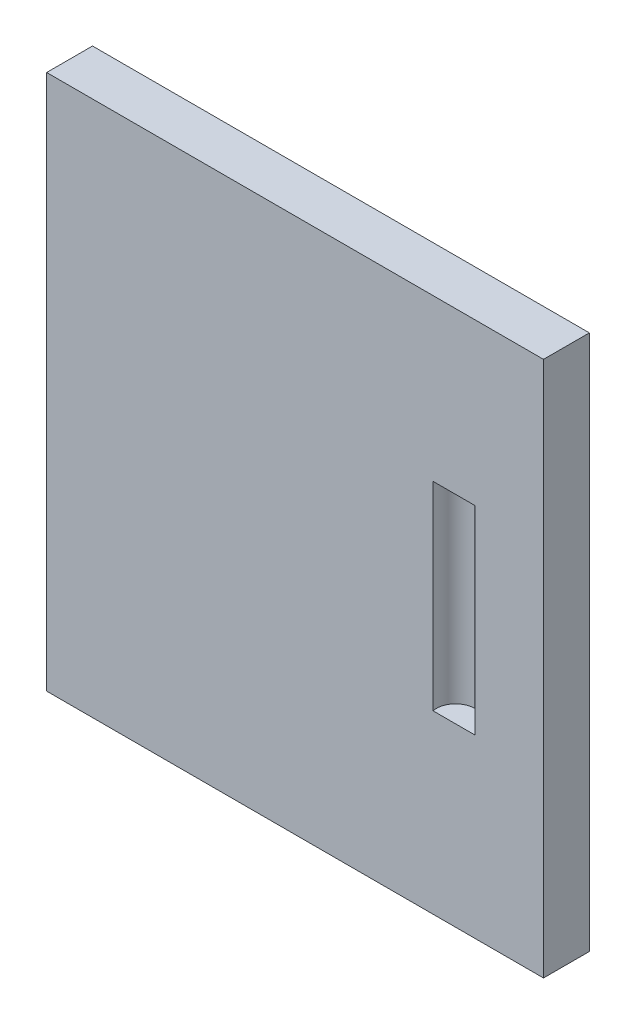
ISO-10303-21;
HEADER;
FILE_DESCRIPTION(('STEP AP214'),'2;1');
FILE_NAME('part.step','',(''),(''),'','','');
FILE_SCHEMA(('AUTOMOTIVE_DESIGN { 1 0 10303 214 1 1 1 1 }'));
ENDSEC;
DATA;
#1=APPLICATION_CONTEXT('core data for automotive mechanical design processes');
#2=APPLICATION_PROTOCOL_DEFINITION('international standard','automotive_design',2000,#1);
#3=PRODUCT_CONTEXT('',#1,'mechanical');
#4=PRODUCT('Part','Part','',(#3));
#5=PRODUCT_RELATED_PRODUCT_CATEGORY('part','',(#4));
#6=PRODUCT_DEFINITION_FORMATION('','',#4);
#7=PRODUCT_DEFINITION_CONTEXT('part definition',#1,'design');
#8=PRODUCT_DEFINITION('design','',#6,#7);
#9=PRODUCT_DEFINITION_SHAPE('','',#8);
#10=(LENGTH_UNIT() NAMED_UNIT(*) SI_UNIT(.MILLI.,.METRE.));
#11=(NAMED_UNIT(*) PLANE_ANGLE_UNIT() SI_UNIT($,.RADIAN.));
#12=(NAMED_UNIT(*) SI_UNIT($,.STERADIAN.) SOLID_ANGLE_UNIT());
#13=UNCERTAINTY_MEASURE_WITH_UNIT(LENGTH_MEASURE(1.E-05),#10,'distance_accuracy_value','');
#14=(GEOMETRIC_REPRESENTATION_CONTEXT(3) GLOBAL_UNCERTAINTY_ASSIGNED_CONTEXT((#13)) GLOBAL_UNIT_ASSIGNED_CONTEXT((#10,
#11,#12)) REPRESENTATION_CONTEXT('',''));
#15=CARTESIAN_POINT('',(0.,0.,0.));
#16=DIRECTION('',(0.,0.,1.));
#17=DIRECTION('',(1.,0.,0.));
#18=AXIS2_PLACEMENT_3D('',#15,#16,#17);
#19=CARTESIAN_POINT('',(-155.,-135.,-5.));
#20=DIRECTION('',(0.,0.,-1.));
#21=DIRECTION('',(-1.,0.,0.));
#22=AXIS2_PLACEMENT_3D('',#19,#20,#21);
#23=CYLINDRICAL_SURFACE('',#22,2.5);
#24=CARTESIAN_POINT('',(-155.,-135.,-5.));
#25=DIRECTION('',(0.,0.,1.));
#26=DIRECTION('',(-1.,0.,0.));
#27=AXIS2_PLACEMENT_3D('',#24,#25,#26);
#28=CIRCLE('',#27,2.5);
#29=CARTESIAN_POINT('',(-157.489397517473,-134.77,-5.));
#30=VERTEX_POINT('',#29);
#31=CARTESIAN_POINT('',(-152.510602482527,-134.77,-5.));
#32=VERTEX_POINT('',#31);
#33=EDGE_CURVE('E150',#30,#32,#28,.T.);
#34=ORIENTED_EDGE('',*,*,#33,.T.);
#35=DIRECTION('',(0.,0.,-1.));
#36=VECTOR('',#35,1.);
#37=CARTESIAN_POINT('',(-152.510602482527,-134.77,-10.));
#38=LINE('',#37,#36);
#39=CARTESIAN_POINT('',(-152.510602482527,-134.77,-15.));
#40=VERTEX_POINT('',#39);
#41=EDGE_CURVE('E143',#32,#40,#38,.T.);
#42=ORIENTED_EDGE('',*,*,#41,.T.);
#43=CARTESIAN_POINT('',(-155.,-135.,-15.));
#44=DIRECTION('',(0.,0.,1.));
#45=DIRECTION('',(-1.,0.,0.));
#46=AXIS2_PLACEMENT_3D('',#43,#44,#45);
#47=CIRCLE('',#46,2.5);
#48=CARTESIAN_POINT('',(-157.489397517473,-134.77,-15.));
#49=VERTEX_POINT('',#48);
#50=EDGE_CURVE('E152',#49,#40,#47,.T.);
#51=ORIENTED_EDGE('',*,*,#50,.F.);
#52=DIRECTION('',(0.,0.,-1.));
#53=VECTOR('',#52,1.);
#54=CARTESIAN_POINT('',(-157.489397517473,-134.77,-10.));
#55=LINE('',#54,#53);
#56=EDGE_CURVE('E140',#49,#30,#55,.F.);
#57=ORIENTED_EDGE('',*,*,#56,.T.);
#58=EDGE_LOOP('',(#34,#42,#51,#57));
#59=FACE_BOUND('',#58,.T.);
#60=ADVANCED_FACE('F45',(#59),#23,.F.);
#61=CARTESIAN_POINT('',(-162.5,-200.,15.));
#62=DIRECTION('',(1.,0.,0.));
#63=DIRECTION('',(0.,0.,-1.));
#64=AXIS2_PLACEMENT_3D('',#61,#62,#63);
#65=PLANE('',#64);
#66=DIRECTION('',(0.,-1.,0.));
#67=VECTOR('',#66,1.);
#68=CARTESIAN_POINT('',(-162.5,-200.,15.));
#69=LINE('',#68,#67);
#70=CARTESIAN_POINT('',(-162.5,150.46,15.));
#71=VERTEX_POINT('',#70);
#72=CARTESIAN_POINT('',(-162.5,-200.,15.));
#73=VERTEX_POINT('',#72);
#74=EDGE_CURVE('E173',#71,#73,#69,.T.);
#75=ORIENTED_EDGE('',*,*,#74,.F.);
#76=DIRECTION('',(0.,0.,1.));
#77=VECTOR('',#76,1.);
#78=CARTESIAN_POINT('',(-162.5,150.46,-15.));
#79=LINE('',#78,#77);
#80=CARTESIAN_POINT('',(-162.5,150.46,-15.));
#81=VERTEX_POINT('',#80);
#82=EDGE_CURVE('E274',#81,#71,#79,.T.);
#83=ORIENTED_EDGE('',*,*,#82,.F.);
#84=DIRECTION('',(0.,-1.,0.));
#85=VECTOR('',#84,1.);
#86=CARTESIAN_POINT('',(-162.5,-200.,-15.));
#87=LINE('',#86,#85);
#88=CARTESIAN_POINT('',(-162.5,-200.,-15.));
#89=VERTEX_POINT('',#88);
#90=EDGE_CURVE('E171',#81,#89,#87,.T.);
#91=ORIENTED_EDGE('',*,*,#90,.T.);
#92=DIRECTION('',(0.,0.,-1.));
#93=VECTOR('',#92,1.);
#94=CARTESIAN_POINT('',(-162.5,-200.,15.));
#95=LINE('',#94,#93);
#96=EDGE_CURVE('E196',#73,#89,#95,.T.);
#97=ORIENTED_EDGE('',*,*,#96,.F.);
#98=EDGE_LOOP('',(#75,#83,#91,#97));
#99=FACE_BOUND('',#98,.T.);
#100=ADVANCED_FACE('F47',(#99),#65,.F.);
#101=CARTESIAN_POINT('',(162.5,-200.,15.));
#102=DIRECTION('',(0.,1.,0.));
#103=DIRECTION('',(-1.,0.,0.));
#104=AXIS2_PLACEMENT_3D('',#101,#102,#103);
#105=PLANE('',#104);
#106=DIRECTION('',(1.,0.,0.));
#107=VECTOR('',#106,1.);
#108=CARTESIAN_POINT('',(162.5,-200.,-15.));
#109=LINE('',#108,#107);
#110=CARTESIAN_POINT('',(162.5,-200.,-15.));
#111=VERTEX_POINT('',#110);
#112=EDGE_CURVE('E187',#89,#111,#109,.T.);
#113=ORIENTED_EDGE('',*,*,#112,.T.);
#114=DIRECTION('',(0.,0.,-1.));
#115=VECTOR('',#114,1.);
#116=CARTESIAN_POINT('',(162.5,-200.,15.));
#117=LINE('',#116,#115);
#118=CARTESIAN_POINT('',(162.5,-200.,15.));
#119=VERTEX_POINT('',#118);
#120=EDGE_CURVE('E184',#119,#111,#117,.T.);
#121=ORIENTED_EDGE('',*,*,#120,.F.);
#122=DIRECTION('',(1.,0.,0.));
#123=VECTOR('',#122,1.);
#124=CARTESIAN_POINT('',(162.5,-200.,15.));
#125=LINE('',#124,#123);
#126=EDGE_CURVE('E176',#73,#119,#125,.T.);
#127=ORIENTED_EDGE('',*,*,#126,.F.);
#128=ORIENTED_EDGE('',*,*,#96,.T.);
#129=EDGE_LOOP('',(#113,#121,#127,#128));
#130=FACE_BOUND('',#129,.T.);
#131=ADVANCED_FACE('F319',(#130),#105,.F.);
#132=CARTESIAN_POINT('',(162.5,-200.,15.));
#133=DIRECTION('',(-1.,0.,0.));
#134=DIRECTION('',(0.,0.,1.));
#135=AXIS2_PLACEMENT_3D('',#132,#133,#134);
#136=PLANE('',#135);
#137=DIRECTION('',(0.,1.,0.));
#138=VECTOR('',#137,1.);
#139=CARTESIAN_POINT('',(162.5,-200.,-15.));
#140=LINE('',#139,#138);
#141=CARTESIAN_POINT('',(162.5,150.46,-15.));
#142=VERTEX_POINT('',#141);
#143=EDGE_CURVE('E177',#111,#142,#140,.T.);
#144=ORIENTED_EDGE('',*,*,#143,.T.);
#145=DIRECTION('',(0.,0.,1.));
#146=VECTOR('',#145,1.);
#147=CARTESIAN_POINT('',(162.5,150.46,15.));
#148=LINE('',#147,#146);
#149=CARTESIAN_POINT('',(162.5,150.46,15.));
#150=VERTEX_POINT('',#149);
#151=EDGE_CURVE('E279',#142,#150,#148,.T.);
#152=ORIENTED_EDGE('',*,*,#151,.T.);
#153=DIRECTION('',(0.,1.,0.));
#154=VECTOR('',#153,1.);
#155=CARTESIAN_POINT('',(162.5,-200.,15.));
#156=LINE('',#155,#154);
#157=EDGE_CURVE('E180',#119,#150,#156,.T.);
#158=ORIENTED_EDGE('',*,*,#157,.F.);
#159=ORIENTED_EDGE('',*,*,#120,.T.);
#160=EDGE_LOOP('',(#144,#152,#158,#159));
#161=FACE_BOUND('',#160,.T.);
#162=ADVANCED_FACE('F330',(#161),#136,.F.);
#163=CARTESIAN_POINT('',(0.,0.,15.));
#164=DIRECTION('',(0.,0.,1.));
#165=DIRECTION('',(1.,0.,0.));
#166=AXIS2_PLACEMENT_3D('',#163,#164,#165);
#167=PLANE('',#166);
#168=DIRECTION('',(1.,0.,0.));
#169=VECTOR('',#168,1.);
#170=CARTESIAN_POINT('',(0.,-84.7699999999999,15.));
#171=LINE('',#170,#169);
#172=CARTESIAN_POINT('',(90.2525512860841,-84.7699999999999,15.));
#173=VERTEX_POINT('',#172);
#174=CARTESIAN_POINT('',(117.625,-84.7699999999999,15.));
#175=VERTEX_POINT('',#174);
#176=EDGE_CURVE('E11',#173,#175,#171,.T.);
#177=ORIENTED_EDGE('',*,*,#176,.F.);
#178=DIRECTION('',(0.,1.,0.));
#179=VECTOR('',#178,1.);
#180=CARTESIAN_POINT('',(90.2525512860841,-84.7699999999999,15.));
#181=LINE('',#180,#179);
#182=CARTESIAN_POINT('',(90.2525512860841,45.2300000000001,15.));
#183=VERTEX_POINT('',#182);
#184=EDGE_CURVE('E54',#183,#173,#181,.F.);
#185=ORIENTED_EDGE('',*,*,#184,.F.);
#186=DIRECTION('',(1.,0.,0.));
#187=VECTOR('',#186,1.);
#188=CARTESIAN_POINT('',(0.,45.2300000000001,15.));
#189=LINE('',#188,#187);
#190=CARTESIAN_POINT('',(117.625,45.2300000000001,15.));
#191=VERTEX_POINT('',#190);
#192=EDGE_CURVE('E200',#183,#191,#189,.T.);
#193=ORIENTED_EDGE('',*,*,#192,.T.);
#194=DIRECTION('',(0.,1.,0.));
#195=VECTOR('',#194,1.);
#196=CARTESIAN_POINT('',(117.625,0.,15.));
#197=LINE('',#196,#195);
#198=EDGE_CURVE('E204',#175,#191,#197,.T.);
#199=ORIENTED_EDGE('',*,*,#198,.F.);
#200=EDGE_LOOP('',(#177,#185,#193,#199));
#201=FACE_BOUND('',#200,.T.);
#202=DIRECTION('',(1.,0.,0.));
#203=VECTOR('',#202,1.);
#204=CARTESIAN_POINT('',(-162.5,150.46,15.));
#205=LINE('',#204,#203);
#206=EDGE_CURVE('E264',#71,#150,#205,.T.);
#207=ORIENTED_EDGE('',*,*,#206,.F.);
#208=ORIENTED_EDGE('',*,*,#74,.T.);
#209=ORIENTED_EDGE('',*,*,#126,.T.);
#210=ORIENTED_EDGE('',*,*,#157,.T.);
#211=EDGE_LOOP('',(#207,#208,#209,#210));
#212=FACE_BOUND('',#211,.T.);
#213=ADVANCED_FACE('F231',(#201,#212),#167,.T.);
#214=CARTESIAN_POINT('',(0.,0.,-15.));
#215=DIRECTION('',(0.,0.,1.));
#216=DIRECTION('',(1.,0.,0.));
#217=AXIS2_PLACEMENT_3D('',#214,#215,#216);
#218=PLANE('',#217);
#219=CARTESIAN_POINT('',(-155.,-134.54,-15.));
#220=DIRECTION('',(0.,0.,1.));
#221=DIRECTION('',(-1.,0.,0.));
#222=AXIS2_PLACEMENT_3D('',#219,#220,#221);
#223=CIRCLE('',#222,2.5);
#224=EDGE_CURVE('E146',#40,#49,#223,.T.);
#225=ORIENTED_EDGE('',*,*,#224,.T.);
#226=ORIENTED_EDGE('',*,*,#50,.T.);
#227=EDGE_LOOP('',(#225,#226));
#228=FACE_BOUND('',#227,.T.);
#229=CARTESIAN_POINT('',(-140.,75.4600000000002,-15.));
#230=DIRECTION('',(0.,0.,-1.));
#231=DIRECTION('',(-1.,0.,0.));
#232=AXIS2_PLACEMENT_3D('',#229,#230,#231);
#233=CIRCLE('',#232,2.5);
#234=CARTESIAN_POINT('',(-142.5,75.4600000000002,-15.));
#235=VERTEX_POINT('',#234);
#236=EDGE_CURVE('E629',#235,#235,#233,.T.);
#237=ORIENTED_EDGE('',*,*,#236,.F.);
#238=EDGE_LOOP('',(#237));
#239=FACE_BOUND('',#238,.T.);
#240=CARTESIAN_POINT('',(-155.,55.4600000000002,-15.));
#241=DIRECTION('',(0.,0.,-1.));
#242=DIRECTION('',(-1.,0.,0.));
#243=AXIS2_PLACEMENT_3D('',#240,#241,#242);
#244=CIRCLE('',#243,2.5);
#245=CARTESIAN_POINT('',(-157.5,55.4600000000002,-15.));
#246=VERTEX_POINT('',#245);
#247=EDGE_CURVE('E642',#246,#246,#244,.T.);
#248=ORIENTED_EDGE('',*,*,#247,.F.);
#249=EDGE_LOOP('',(#248));
#250=FACE_BOUND('',#249,.T.);
#251=CARTESIAN_POINT('',(-140.,-115.,-15.));
#252=DIRECTION('',(0.,0.,1.));
#253=DIRECTION('',(-1.,0.,0.));
#254=AXIS2_PLACEMENT_3D('',#251,#252,#253);
#255=CIRCLE('',#254,2.5);
#256=CARTESIAN_POINT('',(-142.5,-115.,-15.));
#257=VERTEX_POINT('',#256);
#258=EDGE_CURVE('E286',#257,#257,#255,.T.);
#259=ORIENTED_EDGE('',*,*,#258,.T.);
#260=EDGE_LOOP('',(#259));
#261=FACE_BOUND('',#260,.T.);
#262=CARTESIAN_POINT('',(-155.,-95.0000000000001,-15.));
#263=DIRECTION('',(0.,0.,1.));
#264=DIRECTION('',(-1.,0.,0.));
#265=AXIS2_PLACEMENT_3D('',#262,#263,#264);
#266=CIRCLE('',#265,2.5);
#267=CARTESIAN_POINT('',(-157.5,-95.0000000000001,-15.));
#268=VERTEX_POINT('',#267);
#269=EDGE_CURVE('E167',#268,#268,#266,.T.);
#270=ORIENTED_EDGE('',*,*,#269,.T.);
#271=EDGE_LOOP('',(#270));
#272=FACE_BOUND('',#271,.T.);
#273=CARTESIAN_POINT('',(-155.,95.0000000000001,-15.));
#274=DIRECTION('',(0.,0.,-1.));
#275=DIRECTION('',(-1.,0.,0.));
#276=AXIS2_PLACEMENT_3D('',#273,#274,#275);
#277=CIRCLE('',#276,2.5);
#278=CARTESIAN_POINT('',(-152.510602482527,95.2300000000001,-15.));
#279=VERTEX_POINT('',#278);
#280=CARTESIAN_POINT('',(-157.489397517473,95.2300000000001,-15.));
#281=VERTEX_POINT('',#280);
#282=EDGE_CURVE('E157',#279,#281,#277,.T.);
#283=ORIENTED_EDGE('',*,*,#282,.F.);
#284=CARTESIAN_POINT('',(-155.,95.4600000000002,-15.));
#285=DIRECTION('',(0.,0.,-1.));
#286=DIRECTION('',(-1.,0.,0.));
#287=AXIS2_PLACEMENT_3D('',#284,#285,#286);
#288=CIRCLE('',#287,2.5);
#289=EDGE_CURVE('E628',#281,#279,#288,.T.);
#290=ORIENTED_EDGE('',*,*,#289,.F.);
#291=EDGE_LOOP('',(#283,#290));
#292=FACE_BOUND('',#291,.T.);
#293=ORIENTED_EDGE('',*,*,#90,.F.);
#294=DIRECTION('',(1.,0.,0.));
#295=VECTOR('',#294,1.);
#296=CARTESIAN_POINT('',(-162.5,150.46,-15.));
#297=LINE('',#296,#295);
#298=EDGE_CURVE('E270',#81,#142,#297,.T.);
#299=ORIENTED_EDGE('',*,*,#298,.T.);
#300=ORIENTED_EDGE('',*,*,#143,.F.);
#301=ORIENTED_EDGE('',*,*,#112,.F.);
#302=EDGE_LOOP('',(#293,#299,#300,#301));
#303=FACE_BOUND('',#302,.T.);
#304=ADVANCED_FACE('F298',(#228,#239,#250,#261,#272,#292,#303),#218,.F.);
#305=CARTESIAN_POINT('',(-155.,95.0000000000001,-5.));
#306=DIRECTION('',(0.,0.,-1.));
#307=DIRECTION('',(-1.,0.,0.));
#308=AXIS2_PLACEMENT_3D('',#305,#306,#307);
#309=CYLINDRICAL_SURFACE('',#308,2.5);
#310=CARTESIAN_POINT('',(-155.,95.0000000000001,-5.));
#311=DIRECTION('',(0.,0.,-1.));
#312=DIRECTION('',(-1.,0.,0.));
#313=AXIS2_PLACEMENT_3D('',#310,#311,#312);
#314=CIRCLE('',#313,2.5);
#315=CARTESIAN_POINT('',(-152.510602482527,95.2300000000001,-5.));
#316=VERTEX_POINT('',#315);
#317=CARTESIAN_POINT('',(-157.489397517473,95.2300000000001,-5.));
#318=VERTEX_POINT('',#317);
#319=EDGE_CURVE('E162',#316,#318,#314,.T.);
#320=ORIENTED_EDGE('',*,*,#319,.F.);
#321=DIRECTION('',(0.,0.,-1.));
#322=VECTOR('',#321,1.);
#323=CARTESIAN_POINT('',(-152.510602482527,95.2300000000001,-10.));
#324=LINE('',#323,#322);
#325=EDGE_CURVE('E251',#316,#279,#324,.T.);
#326=ORIENTED_EDGE('',*,*,#325,.T.);
#327=ORIENTED_EDGE('',*,*,#282,.T.);
#328=DIRECTION('',(0.,0.,-1.));
#329=VECTOR('',#328,1.);
#330=CARTESIAN_POINT('',(-157.489397517473,95.2300000000001,-10.));
#331=LINE('',#330,#329);
#332=EDGE_CURVE('E646',#281,#318,#331,.F.);
#333=ORIENTED_EDGE('',*,*,#332,.T.);
#334=EDGE_LOOP('',(#320,#326,#327,#333));
#335=FACE_BOUND('',#334,.T.);
#336=ADVANCED_FACE('F324',(#335),#309,.F.);
#337=CARTESIAN_POINT('',(-155.,95.0000000000001,-5.));
#338=DIRECTION('',(0.,0.,-1.));
#339=DIRECTION('',(-1.,0.,0.));
#340=AXIS2_PLACEMENT_3D('',#337,#338,#339);
#341=PLANE('',#340);
#342=ORIENTED_EDGE('',*,*,#319,.T.);
#343=CARTESIAN_POINT('',(-155.,95.4600000000002,-5.));
#344=DIRECTION('',(0.,0.,-1.));
#345=DIRECTION('',(-1.,0.,0.));
#346=AXIS2_PLACEMENT_3D('',#343,#344,#345);
#347=CIRCLE('',#346,2.5);
#348=EDGE_CURVE('E67',#318,#316,#347,.T.);
#349=ORIENTED_EDGE('',*,*,#348,.T.);
#350=EDGE_LOOP('',(#342,#349));
#351=FACE_BOUND('',#350,.T.);
#352=ADVANCED_FACE('F312',(#351),#341,.T.);
#353=CARTESIAN_POINT('',(-155.,-135.,-5.));
#354=DIRECTION('',(0.,0.,-1.));
#355=DIRECTION('',(-1.,0.,0.));
#356=AXIS2_PLACEMENT_3D('',#353,#354,#355);
#357=PLANE('',#356);
#358=ORIENTED_EDGE('',*,*,#33,.F.);
#359=CARTESIAN_POINT('',(-155.,-134.54,-5.));
#360=DIRECTION('',(0.,0.,1.));
#361=DIRECTION('',(-1.,0.,0.));
#362=AXIS2_PLACEMENT_3D('',#359,#360,#361);
#363=CIRCLE('',#362,2.5);
#364=EDGE_CURVE('E60',#32,#30,#363,.T.);
#365=ORIENTED_EDGE('',*,*,#364,.F.);
#366=EDGE_LOOP('',(#358,#365));
#367=FACE_BOUND('',#366,.T.);
#368=ADVANCED_FACE('F155',(#367),#357,.T.);
#369=CARTESIAN_POINT('',(-155.,-95.0000000000001,-5.));
#370=DIRECTION('',(0.,0.,-1.));
#371=DIRECTION('',(-1.,0.,0.));
#372=AXIS2_PLACEMENT_3D('',#369,#370,#371);
#373=CYLINDRICAL_SURFACE('',#372,2.5);
#374=CARTESIAN_POINT('',(-155.,-95.0000000000001,-5.));
#375=DIRECTION('',(0.,0.,1.));
#376=DIRECTION('',(-1.,0.,0.));
#377=AXIS2_PLACEMENT_3D('',#374,#375,#376);
#378=CIRCLE('',#377,2.5);
#379=CARTESIAN_POINT('',(-157.5,-95.0000000000001,-5.));
#380=VERTEX_POINT('',#379);
#381=EDGE_CURVE('E289',#380,#380,#378,.T.);
#382=ORIENTED_EDGE('',*,*,#381,.T.);
#383=EDGE_LOOP('',(#382));
#384=FACE_BOUND('',#383,.T.);
#385=ORIENTED_EDGE('',*,*,#269,.F.);
#386=EDGE_LOOP('',(#385));
#387=FACE_BOUND('',#386,.T.);
#388=ADVANCED_FACE('F301',(#384,#387),#373,.F.);
#389=CARTESIAN_POINT('',(-155.,-95.0000000000001,-5.));
#390=DIRECTION('',(0.,0.,-1.));
#391=DIRECTION('',(-1.,0.,0.));
#392=AXIS2_PLACEMENT_3D('',#389,#390,#391);
#393=PLANE('',#392);
#394=ORIENTED_EDGE('',*,*,#381,.F.);
#395=EDGE_LOOP('',(#394));
#396=FACE_BOUND('',#395,.T.);
#397=ADVANCED_FACE('F303',(#396),#393,.T.);
#398=CARTESIAN_POINT('',(-140.,-115.,-5.));
#399=DIRECTION('',(0.,0.,-1.));
#400=DIRECTION('',(-1.,0.,0.));
#401=AXIS2_PLACEMENT_3D('',#398,#399,#400);
#402=CYLINDRICAL_SURFACE('',#401,2.5);
#403=CARTESIAN_POINT('',(-140.,-115.,-5.));
#404=DIRECTION('',(0.,0.,1.));
#405=DIRECTION('',(-1.,0.,0.));
#406=AXIS2_PLACEMENT_3D('',#403,#404,#405);
#407=CIRCLE('',#406,2.5);
#408=CARTESIAN_POINT('',(-142.5,-115.,-5.));
#409=VERTEX_POINT('',#408);
#410=EDGE_CURVE('E164',#409,#409,#407,.T.);
#411=ORIENTED_EDGE('',*,*,#410,.T.);
#412=EDGE_LOOP('',(#411));
#413=FACE_BOUND('',#412,.T.);
#414=ORIENTED_EDGE('',*,*,#258,.F.);
#415=EDGE_LOOP('',(#414));
#416=FACE_BOUND('',#415,.T.);
#417=ADVANCED_FACE('F309',(#413,#416),#402,.F.);
#418=CARTESIAN_POINT('',(-140.,-115.,-5.));
#419=DIRECTION('',(0.,0.,-1.));
#420=DIRECTION('',(-1.,0.,0.));
#421=AXIS2_PLACEMENT_3D('',#418,#419,#420);
#422=PLANE('',#421);
#423=ORIENTED_EDGE('',*,*,#410,.F.);
#424=EDGE_LOOP('',(#423));
#425=FACE_BOUND('',#424,.T.);
#426=ADVANCED_FACE('F354',(#425),#422,.T.);
#427=CARTESIAN_POINT('',(-162.5,150.46,-15.));
#428=DIRECTION('',(0.,-1.,0.));
#429=DIRECTION('',(0.,0.,-1.));
#430=AXIS2_PLACEMENT_3D('',#427,#428,#429);
#431=PLANE('',#430);
#432=ORIENTED_EDGE('',*,*,#298,.F.);
#433=ORIENTED_EDGE('',*,*,#82,.T.);
#434=ORIENTED_EDGE('',*,*,#206,.T.);
#435=ORIENTED_EDGE('',*,*,#151,.F.);
#436=EDGE_LOOP('',(#432,#433,#434,#435));
#437=FACE_BOUND('',#436,.T.);
#438=ADVANCED_FACE('F350',(#437),#431,.F.);
#439=CARTESIAN_POINT('',(102.5,-84.7699999999999,12.5));
#440=DIRECTION('',(0.,1.,0.));
#441=DIRECTION('',(0.,0.,1.));
#442=AXIS2_PLACEMENT_3D('',#439,#440,#441);
#443=CYLINDRICAL_SURFACE('',#442,12.5);
#444=ORIENTED_EDGE('',*,*,#184,.T.);
#445=CARTESIAN_POINT('',(102.5,-84.7699999999999,12.5));
#446=DIRECTION('',(0.,1.,0.));
#447=DIRECTION('',(0.,0.,-1.));
#448=AXIS2_PLACEMENT_3D('',#445,#446,#447);
#449=CIRCLE('',#448,12.5);
#450=CARTESIAN_POINT('',(102.5,-84.7699999999999,0.));
#451=VERTEX_POINT('',#450);
#452=EDGE_CURVE('E214',#451,#173,#449,.T.);
#453=ORIENTED_EDGE('',*,*,#452,.F.);
#454=DIRECTION('',(0.,1.,0.));
#455=VECTOR('',#454,1.);
#456=CARTESIAN_POINT('',(102.5,-84.7699999999999,0.));
#457=LINE('',#456,#455);
#458=CARTESIAN_POINT('',(102.5,45.2300000000001,0.));
#459=VERTEX_POINT('',#458);
#460=EDGE_CURVE('E261',#451,#459,#457,.T.);
#461=ORIENTED_EDGE('',*,*,#460,.T.);
#462=CARTESIAN_POINT('',(102.5,45.2300000000001,12.5));
#463=DIRECTION('',(0.,1.,0.));
#464=DIRECTION('',(0.,0.,-1.));
#465=AXIS2_PLACEMENT_3D('',#462,#463,#464);
#466=CIRCLE('',#465,12.5);
#467=EDGE_CURVE('E217',#459,#183,#466,.T.);
#468=ORIENTED_EDGE('',*,*,#467,.T.);
#469=EDGE_LOOP('',(#444,#453,#461,#468));
#470=FACE_BOUND('',#469,.T.);
#471=ADVANCED_FACE('F213',(#470),#443,.F.);
#472=CARTESIAN_POINT('',(102.5,-84.7699999999999,0.));
#473=DIRECTION('',(0.,0.,-1.));
#474=DIRECTION('',(-1.,0.,0.));
#475=AXIS2_PLACEMENT_3D('',#472,#473,#474);
#476=PLANE('',#475);
#477=DIRECTION('',(-1.,0.,0.));
#478=VECTOR('',#477,1.);
#479=CARTESIAN_POINT('',(102.5,45.2300000000001,0.));
#480=LINE('',#479,#478);
#481=CARTESIAN_POINT('',(120.5,45.2300000000001,0.));
#482=VERTEX_POINT('',#481);
#483=EDGE_CURVE('E228',#482,#459,#480,.T.);
#484=ORIENTED_EDGE('',*,*,#483,.T.);
#485=ORIENTED_EDGE('',*,*,#460,.F.);
#486=DIRECTION('',(-1.,0.,0.));
#487=VECTOR('',#486,1.);
#488=CARTESIAN_POINT('',(102.5,-84.7699999999999,0.));
#489=LINE('',#488,#487);
#490=CARTESIAN_POINT('',(120.5,-84.7699999999999,0.));
#491=VERTEX_POINT('',#490);
#492=EDGE_CURVE('E225',#491,#451,#489,.T.);
#493=ORIENTED_EDGE('',*,*,#492,.F.);
#494=DIRECTION('',(0.,1.,0.));
#495=VECTOR('',#494,1.);
#496=CARTESIAN_POINT('',(120.5,-84.7699999999999,0.));
#497=LINE('',#496,#495);
#498=EDGE_CURVE('E265',#491,#482,#497,.T.);
#499=ORIENTED_EDGE('',*,*,#498,.T.);
#500=EDGE_LOOP('',(#484,#485,#493,#499));
#501=FACE_BOUND('',#500,.T.);
#502=ADVANCED_FACE('F360',(#501),#476,.F.);
#503=CARTESIAN_POINT('',(120.5,-84.7699999999999,5.));
#504=DIRECTION('',(0.,1.,0.));
#505=DIRECTION('',(0.,0.,1.));
#506=AXIS2_PLACEMENT_3D('',#503,#504,#505);
#507=CYLINDRICAL_SURFACE('',#506,5.);
#508=CARTESIAN_POINT('',(120.5,45.2300000000001,5.));
#509=DIRECTION('',(0.,1.,0.));
#510=DIRECTION('',(0.,0.,-1.));
#511=AXIS2_PLACEMENT_3D('',#508,#509,#510);
#512=CIRCLE('',#511,5.);
#513=CARTESIAN_POINT('',(124.050295857988,45.2300000000001,8.5207100591716));
#514=VERTEX_POINT('',#513);
#515=EDGE_CURVE('E254',#514,#482,#512,.T.);
#516=ORIENTED_EDGE('',*,*,#515,.T.);
#517=ORIENTED_EDGE('',*,*,#498,.F.);
#518=CARTESIAN_POINT('',(120.5,-84.7699999999999,5.));
#519=DIRECTION('',(0.,1.,0.));
#520=DIRECTION('',(0.,0.,-1.));
#521=AXIS2_PLACEMENT_3D('',#518,#519,#520);
#522=CIRCLE('',#521,5.);
#523=CARTESIAN_POINT('',(124.050295857988,-84.7699999999999,8.5207100591716));
#524=VERTEX_POINT('',#523);
#525=EDGE_CURVE('E241',#524,#491,#522,.T.);
#526=ORIENTED_EDGE('',*,*,#525,.F.);
#527=DIRECTION('',(0.,1.,0.));
#528=VECTOR('',#527,1.);
#529=CARTESIAN_POINT('',(124.050295857988,-84.7699999999999,8.5207100591716));
#530=LINE('',#529,#528);
#531=EDGE_CURVE('E238',#524,#514,#530,.T.);
#532=ORIENTED_EDGE('',*,*,#531,.T.);
#533=EDGE_LOOP('',(#516,#517,#526,#532));
#534=FACE_BOUND('',#533,.T.);
#535=ADVANCED_FACE('F418',(#534),#507,.F.);
#536=CARTESIAN_POINT('',(124.050295857988,-84.7699999999999,8.52071005917159));
#537=DIRECTION('',(0.710059171597633,0.,0.70414201183432));
#538=DIRECTION('',(0.70414201183432,0.,-0.710059171597633));
#539=AXIS2_PLACEMENT_3D('',#536,#537,#538);
#540=PLANE('',#539);
#541=ORIENTED_EDGE('',*,*,#198,.T.);
#542=DIRECTION('',(0.70414201183432,0.,-0.710059171597633));
#543=VECTOR('',#542,1.);
#544=CARTESIAN_POINT('',(124.050295857988,45.2300000000001,8.52071005917159));
#545=LINE('',#544,#543);
#546=EDGE_CURVE('E236',#191,#514,#545,.T.);
#547=ORIENTED_EDGE('',*,*,#546,.T.);
#548=ORIENTED_EDGE('',*,*,#531,.F.);
#549=DIRECTION('',(0.70414201183432,0.,-0.710059171597633));
#550=VECTOR('',#549,1.);
#551=CARTESIAN_POINT('',(124.050295857988,-84.7699999999999,8.52071005917159));
#552=LINE('',#551,#550);
#553=EDGE_CURVE('E227',#175,#524,#552,.T.);
#554=ORIENTED_EDGE('',*,*,#553,.F.);
#555=EDGE_LOOP('',(#541,#547,#548,#554));
#556=FACE_BOUND('',#555,.T.);
#557=ADVANCED_FACE('F234',(#556),#540,.F.);
#558=CARTESIAN_POINT('',(102.5,-84.7699999999999,12.5));
#559=DIRECTION('',(0.,-1.,0.));
#560=DIRECTION('',(0.,0.,-1.));
#561=AXIS2_PLACEMENT_3D('',#558,#559,#560);
#562=PLANE('',#561);
#563=ORIENTED_EDGE('',*,*,#176,.T.);
#564=ORIENTED_EDGE('',*,*,#553,.T.);
#565=ORIENTED_EDGE('',*,*,#525,.T.);
#566=ORIENTED_EDGE('',*,*,#492,.T.);
#567=ORIENTED_EDGE('',*,*,#452,.T.);
#568=EDGE_LOOP('',(#563,#564,#565,#566,#567));
#569=FACE_BOUND('',#568,.T.);
#570=ADVANCED_FACE('F221',(#569),#562,.F.);
#571=CARTESIAN_POINT('',(102.5,45.2300000000001,12.5));
#572=DIRECTION('',(0.,-1.,0.));
#573=DIRECTION('',(0.,0.,-1.));
#574=AXIS2_PLACEMENT_3D('',#571,#572,#573);
#575=PLANE('',#574);
#576=ORIENTED_EDGE('',*,*,#467,.F.);
#577=ORIENTED_EDGE('',*,*,#483,.F.);
#578=ORIENTED_EDGE('',*,*,#515,.F.);
#579=ORIENTED_EDGE('',*,*,#546,.F.);
#580=ORIENTED_EDGE('',*,*,#192,.F.);
#581=EDGE_LOOP('',(#576,#577,#578,#579,#580));
#582=FACE_BOUND('',#581,.T.);
#583=ADVANCED_FACE('F447',(#582),#575,.T.);
#584=CARTESIAN_POINT('',(-155.,95.4600000000002,-5.));
#585=DIRECTION('',(0.,0.,-1.));
#586=DIRECTION('',(-1.,0.,0.));
#587=AXIS2_PLACEMENT_3D('',#584,#585,#586);
#588=CYLINDRICAL_SURFACE('',#587,2.5);
#589=ORIENTED_EDGE('',*,*,#348,.F.);
#590=ORIENTED_EDGE('',*,*,#332,.F.);
#591=ORIENTED_EDGE('',*,*,#289,.T.);
#592=ORIENTED_EDGE('',*,*,#325,.F.);
#593=EDGE_LOOP('',(#589,#590,#591,#592));
#594=FACE_BOUND('',#593,.T.);
#595=ADVANCED_FACE('F456',(#594),#588,.F.);
#596=CARTESIAN_POINT('',(-155.,55.4600000000002,-5.));
#597=DIRECTION('',(0.,0.,-1.));
#598=DIRECTION('',(-1.,0.,0.));
#599=AXIS2_PLACEMENT_3D('',#596,#597,#598);
#600=CYLINDRICAL_SURFACE('',#599,2.5);
#601=CARTESIAN_POINT('',(-155.,55.4600000000002,-5.));
#602=DIRECTION('',(0.,0.,-1.));
#603=DIRECTION('',(-1.,0.,0.));
#604=AXIS2_PLACEMENT_3D('',#601,#602,#603);
#605=CIRCLE('',#604,2.5);
#606=CARTESIAN_POINT('',(-157.5,55.4600000000002,-5.));
#607=VERTEX_POINT('',#606);
#608=EDGE_CURVE('E635',#607,#607,#605,.T.);
#609=ORIENTED_EDGE('',*,*,#608,.F.);
#610=EDGE_LOOP('',(#609));
#611=FACE_BOUND('',#610,.T.);
#612=ORIENTED_EDGE('',*,*,#247,.T.);
#613=EDGE_LOOP('',(#612));
#614=FACE_BOUND('',#613,.T.);
#615=ADVANCED_FACE('F495',(#611,#614),#600,.F.);
#616=CARTESIAN_POINT('',(-155.,55.4600000000002,-5.));
#617=DIRECTION('',(0.,0.,-1.));
#618=DIRECTION('',(-1.,0.,0.));
#619=AXIS2_PLACEMENT_3D('',#616,#617,#618);
#620=PLANE('',#619);
#621=ORIENTED_EDGE('',*,*,#608,.T.);
#622=EDGE_LOOP('',(#621));
#623=FACE_BOUND('',#622,.T.);
#624=ADVANCED_FACE('F505',(#623),#620,.T.);
#625=CARTESIAN_POINT('',(-140.,75.4600000000002,-5.));
#626=DIRECTION('',(0.,0.,-1.));
#627=DIRECTION('',(-1.,0.,0.));
#628=AXIS2_PLACEMENT_3D('',#625,#626,#627);
#629=CYLINDRICAL_SURFACE('',#628,2.5);
#630=CARTESIAN_POINT('',(-140.,75.4600000000002,-5.));
#631=DIRECTION('',(0.,0.,-1.));
#632=DIRECTION('',(-1.,0.,0.));
#633=AXIS2_PLACEMENT_3D('',#630,#631,#632);
#634=CIRCLE('',#633,2.5);
#635=CARTESIAN_POINT('',(-142.5,75.4600000000002,-5.));
#636=VERTEX_POINT('',#635);
#637=EDGE_CURVE('E626',#636,#636,#634,.T.);
#638=ORIENTED_EDGE('',*,*,#637,.F.);
#639=EDGE_LOOP('',(#638));
#640=FACE_BOUND('',#639,.T.);
#641=ORIENTED_EDGE('',*,*,#236,.T.);
#642=EDGE_LOOP('',(#641));
#643=FACE_BOUND('',#642,.T.);
#644=ADVANCED_FACE('F516',(#640,#643),#629,.F.);
#645=CARTESIAN_POINT('',(-140.,75.4600000000002,-5.));
#646=DIRECTION('',(0.,0.,-1.));
#647=DIRECTION('',(-1.,0.,0.));
#648=AXIS2_PLACEMENT_3D('',#645,#646,#647);
#649=PLANE('',#648);
#650=ORIENTED_EDGE('',*,*,#637,.T.);
#651=EDGE_LOOP('',(#650));
#652=FACE_BOUND('',#651,.T.);
#653=ADVANCED_FACE('F527',(#652),#649,.T.);
#654=CARTESIAN_POINT('',(-155.,-134.54,-5.));
#655=DIRECTION('',(0.,0.,-1.));
#656=DIRECTION('',(-1.,0.,0.));
#657=AXIS2_PLACEMENT_3D('',#654,#655,#656);
#658=CYLINDRICAL_SURFACE('',#657,2.5);
#659=ORIENTED_EDGE('',*,*,#364,.T.);
#660=ORIENTED_EDGE('',*,*,#56,.F.);
#661=ORIENTED_EDGE('',*,*,#224,.F.);
#662=ORIENTED_EDGE('',*,*,#41,.F.);
#663=EDGE_LOOP('',(#659,#660,#661,#662));
#664=FACE_BOUND('',#663,.T.);
#665=ADVANCED_FACE('F139',(#664),#658,.F.);
#666=CLOSED_SHELL('',(#60,#100,#131,#162,#213,#304,#336,#352,#368,#388,#397,#417,#426,#438,#471,
#502,#535,#557,#570,#583,#595,#615,#624,#644,#653,#665));
#667=MANIFOLD_SOLID_BREP('B2',#666);
#668=ADVANCED_BREP_SHAPE_REPRESENTATION('',(#18,#667),#14);
#669=SHAPE_DEFINITION_REPRESENTATION(#9,#668);
ENDSEC;
END-ISO-10303-21;
